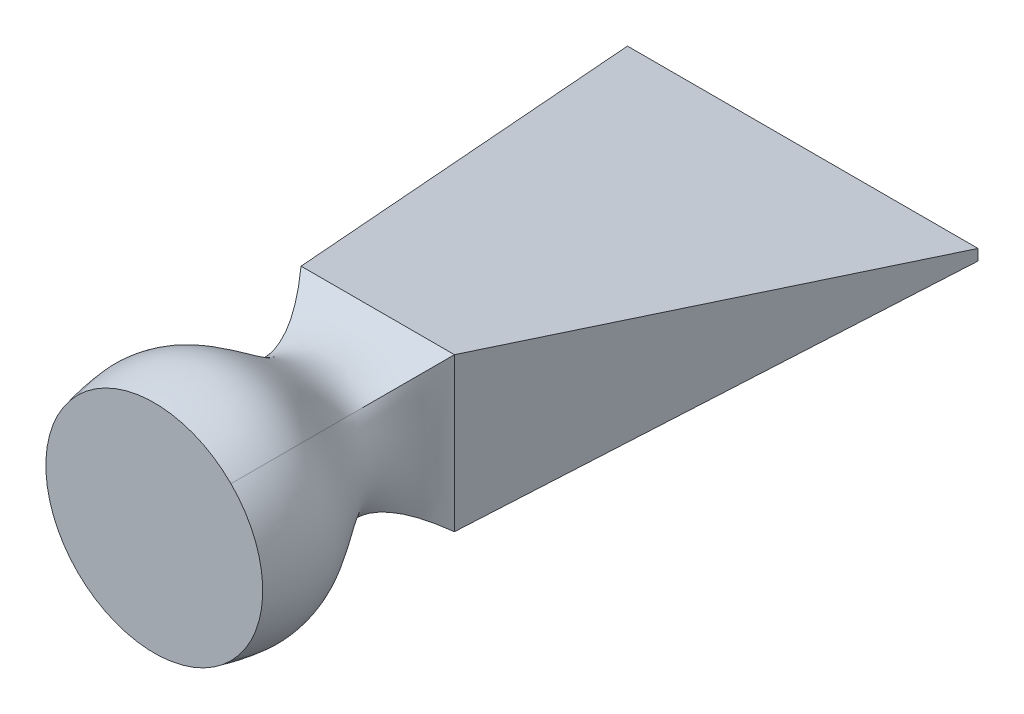
ISO-10303-21;
HEADER;
FILE_DESCRIPTION(('STEP AP214'),'2;1');
FILE_NAME('part.step','',(''),(''),'','','');
FILE_SCHEMA(('AUTOMOTIVE_DESIGN { 1 0 10303 214 1 1 1 1 }'));
ENDSEC;
DATA;
#1=APPLICATION_CONTEXT('core data for automotive mechanical design processes');
#2=APPLICATION_PROTOCOL_DEFINITION('international standard','automotive_design',2000,#1);
#3=PRODUCT_CONTEXT('',#1,'mechanical');
#4=PRODUCT('Part','Part','',(#3));
#5=PRODUCT_RELATED_PRODUCT_CATEGORY('part','',(#4));
#6=PRODUCT_DEFINITION_FORMATION('','',#4);
#7=PRODUCT_DEFINITION_CONTEXT('part definition',#1,'design');
#8=PRODUCT_DEFINITION('design','',#6,#7);
#9=PRODUCT_DEFINITION_SHAPE('','',#8);
#10=(LENGTH_UNIT() NAMED_UNIT(*) SI_UNIT(.MILLI.,.METRE.));
#11=(NAMED_UNIT(*) PLANE_ANGLE_UNIT() SI_UNIT($,.RADIAN.));
#12=(NAMED_UNIT(*) SI_UNIT($,.STERADIAN.) SOLID_ANGLE_UNIT());
#13=UNCERTAINTY_MEASURE_WITH_UNIT(LENGTH_MEASURE(1.E-05),#10,'distance_accuracy_value','');
#14=(GEOMETRIC_REPRESENTATION_CONTEXT(3) GLOBAL_UNCERTAINTY_ASSIGNED_CONTEXT((#13)) GLOBAL_UNIT_ASSIGNED_CONTEXT((#10,
#11,#12)) REPRESENTATION_CONTEXT('',''));
#15=CARTESIAN_POINT('',(0.,0.,0.));
#16=DIRECTION('',(0.,0.,1.));
#17=DIRECTION('',(1.,0.,0.));
#18=AXIS2_PLACEMENT_3D('',#15,#16,#17);
#19=CARTESIAN_POINT('',(0.,0.,102.));
#20=DIRECTION('',(0.,0.,1.));
#21=DIRECTION('',(1.,0.,0.));
#22=AXIS2_PLACEMENT_3D('',#19,#20,#21);
#23=PLANE('',#22);
#24=CARTESIAN_POINT('',(0.,0.,102.));
#25=DIRECTION('',(0.,0.,1.));
#26=DIRECTION('',(1.,0.,0.));
#27=AXIS2_PLACEMENT_3D('',#24,#25,#26);
#28=CIRCLE('',#27,49.4974746830583);
#29=CARTESIAN_POINT('',(-35.,35.,102.));
#30=VERTEX_POINT('',#29);
#31=CARTESIAN_POINT('',(-35.,-35.,102.));
#32=VERTEX_POINT('',#31);
#33=EDGE_CURVE('E12',#30,#32,#28,.T.);
#34=ORIENTED_EDGE('',*,*,#33,.T.);
#35=CARTESIAN_POINT('',(35.,-35.,102.));
#36=VERTEX_POINT('',#35);
#37=EDGE_CURVE('E82',#32,#36,#28,.T.);
#38=ORIENTED_EDGE('',*,*,#37,.T.);
#39=CARTESIAN_POINT('',(35.,35.,102.));
#40=VERTEX_POINT('',#39);
#41=EDGE_CURVE('E438',#36,#40,#28,.T.);
#42=ORIENTED_EDGE('',*,*,#41,.T.);
#43=EDGE_CURVE('E259',#40,#30,#28,.T.);
#44=ORIENTED_EDGE('',*,*,#43,.T.);
#45=EDGE_LOOP('',(#34,#38,#42,#44));
#46=FACE_BOUND('',#45,.T.);
#47=ADVANCED_FACE('F73',(#46),#23,.T.);
#48=CARTESIAN_POINT('',(-35.,-35.,0.));
#49=CARTESIAN_POINT('',(-25.8088022903976,-25.8088022903976,11.3333333333333));
#50=CARTESIAN_POINT('',(-13.9740324333379,-13.9740324333379,35.7263836367492));
#51=CARTESIAN_POINT('',(-39.2320888821546,-39.2320888821546,65.1603499334401));
#52=CARTESIAN_POINT('',(-37.1232419745733,-37.1232419745733,89.805704750183));
#53=CARTESIAN_POINT('',(-35.,-35.,102.));
#54=CARTESIAN_POINT('',(-11.6666666666667,-35.,0.));
#55=CARTESIAN_POINT('',(-8.60293409679921,-25.8088022903976,11.3333333333333));
#56=CARTESIAN_POINT('',(-7.70816347421794,-28.644191323389,35.7263836367492));
#57=CARTESIAN_POINT('',(-17.3372478460093,-59.7206332348576,65.1603499334401));
#58=CARTESIAN_POINT('',(-16.3907219775493,-56.4402673218818,89.805704750183));
#59=CARTESIAN_POINT('',(-15.6829746526915,-54.3170253473085,102.));
#60=CARTESIAN_POINT('',(11.6666666666667,-35.,0.));
#61=CARTESIAN_POINT('',(8.6029340967992,-25.8088022903976,11.3333333333333));
#62=CARTESIAN_POINT('',(7.70816347421792,-28.644191323389,35.7263836367492));
#63=CARTESIAN_POINT('',(17.3372478460093,-59.7206332348576,65.1603499334401));
#64=CARTESIAN_POINT('',(16.3907219775492,-56.4402673218818,89.805704750183));
#65=CARTESIAN_POINT('',(15.6829746526915,-54.3170253473085,102.));
#66=CARTESIAN_POINT('',(35.,-35.,0.));
#67=CARTESIAN_POINT('',(25.8088022903976,-25.8088022903976,11.3333333333333));
#68=CARTESIAN_POINT('',(13.9740324333379,-13.9740324333379,35.7263836367492));
#69=CARTESIAN_POINT('',(39.2320888821546,-39.2320888821546,65.1603499334401));
#70=CARTESIAN_POINT('',(37.1232419745732,-37.1232419745733,89.805704750183));
#71=CARTESIAN_POINT('',(35.,-35.,102.));
#72=B_SPLINE_SURFACE_WITH_KNOTS('',3,3,((#48,#49,#50,#51,#52,#53),(#54,#55,#56,#57,#58,#59),
(#60,#61,#62,#63,#64,#65),(#66,#67,#68,#69,#70,#71)),.UNSPECIFIED.,.F.,.F.,.F.,(4,4),(4,1,1,4),
(0.,1.),(0.,0.334441723312643,0.690834592156618,1.),.UNSPECIFIED.);
#73=DIRECTION('',(1.,0.,0.));
#74=VECTOR('',#73,1.);
#75=CARTESIAN_POINT('',(-35.,-35.,0.));
#76=LINE('',#75,#74);
#77=CARTESIAN_POINT('',(-35.,-35.,0.));
#78=VERTEX_POINT('',#77);
#79=CARTESIAN_POINT('',(35.,-35.,0.));
#80=VERTEX_POINT('',#79);
#81=EDGE_CURVE('E299',#78,#80,#76,.T.);
#82=CARTESIAN_POINT('',(35.,-35.,0.));
#83=CARTESIAN_POINT('',(25.8088022903976,-25.8088022903976,11.3333333333333));
#84=CARTESIAN_POINT('',(13.9740324333379,-13.9740324333379,35.7263836367492));
#85=CARTESIAN_POINT('',(39.2320888821546,-39.2320888821546,65.1603499334401));
#86=CARTESIAN_POINT('',(37.1232419745732,-37.1232419745733,89.805704750183));
#87=CARTESIAN_POINT('',(35.,-35.,102.));
#88=B_SPLINE_CURVE_WITH_KNOTS('',3,(#82,#83,#84,#85,#86,#87),.UNSPECIFIED.,.F.,.F.,(4,1,1,4),
(0.,0.334441723312643,0.690834592156618,1.),.UNSPECIFIED.);
#89=EDGE_CURVE('E279',#80,#36,#88,.T.);
#90=CARTESIAN_POINT('',(-35.,-35.,0.));
#91=CARTESIAN_POINT('',(-25.8088022903976,-25.8088022903976,11.3333333333333));
#92=CARTESIAN_POINT('',(-13.9740324333379,-13.9740324333379,35.7263836367492));
#93=CARTESIAN_POINT('',(-39.2320888821546,-39.2320888821546,65.1603499334401));
#94=CARTESIAN_POINT('',(-37.1232419745733,-37.1232419745733,89.805704750183));
#95=CARTESIAN_POINT('',(-35.,-35.,102.));
#96=B_SPLINE_CURVE_WITH_KNOTS('',3,(#90,#91,#92,#93,#94,#95),.UNSPECIFIED.,.F.,.F.,(4,1,1,4),
(0.,0.334441723312643,0.690834592156618,1.),.UNSPECIFIED.);
#97=EDGE_CURVE('E289',#32,#78,#96,.F.);
#98=ORIENTED_EDGE('',*,*,#81,.T.);
#99=ORIENTED_EDGE('',*,*,#89,.T.);
#100=ORIENTED_EDGE('',*,*,#37,.F.);
#101=ORIENTED_EDGE('',*,*,#97,.T.);
#102=EDGE_LOOP('',(#98,#99,#100,#101));
#103=FACE_BOUND('',#102,.T.);
#104=ADVANCED_FACE('F186',(#103),#72,.T.);
#105=CARTESIAN_POINT('',(35.,-35.,0.));
#106=CARTESIAN_POINT('',(25.8088022903976,-25.8088022903976,11.3333333333333));
#107=CARTESIAN_POINT('',(13.9740324333379,-13.9740324333379,35.7263836367492));
#108=CARTESIAN_POINT('',(39.2320888821546,-39.2320888821546,65.1603499334401));
#109=CARTESIAN_POINT('',(37.1232419745732,-37.1232419745733,89.805704750183));
#110=CARTESIAN_POINT('',(35.,-35.,102.));
#111=CARTESIAN_POINT('',(35.,-11.6666666666667,0.));
#112=CARTESIAN_POINT('',(25.8088022903976,-8.60293409679921,11.3333333333333));
#113=CARTESIAN_POINT('',(28.644191323389,-7.70816347421794,35.7263836367492));
#114=CARTESIAN_POINT('',(59.7206332348576,-17.3372478460093,65.1603499334401));
#115=CARTESIAN_POINT('',(56.4402673218818,-16.3907219775493,89.805704750183));
#116=CARTESIAN_POINT('',(54.3170253473085,-15.6829746526915,102.));
#117=CARTESIAN_POINT('',(35.,11.6666666666667,0.));
#118=CARTESIAN_POINT('',(25.8088022903976,8.6029340967992,11.3333333333333));
#119=CARTESIAN_POINT('',(28.644191323389,7.70816347421792,35.7263836367492));
#120=CARTESIAN_POINT('',(59.7206332348576,17.3372478460093,65.1603499334401));
#121=CARTESIAN_POINT('',(56.4402673218818,16.3907219775492,89.805704750183));
#122=CARTESIAN_POINT('',(54.3170253473085,15.6829746526915,102.));
#123=CARTESIAN_POINT('',(35.,35.,0.));
#124=CARTESIAN_POINT('',(25.8088022903976,25.8088022903976,11.3333333333333));
#125=CARTESIAN_POINT('',(13.9740324333379,13.9740324333379,35.7263836367492));
#126=CARTESIAN_POINT('',(39.2320888821546,39.2320888821546,65.1603499334401));
#127=CARTESIAN_POINT('',(37.1232419745733,37.1232419745732,89.805704750183));
#128=CARTESIAN_POINT('',(35.,35.,102.));
#129=B_SPLINE_SURFACE_WITH_KNOTS('',3,3,((#105,#106,#107,#108,#109,#110),(#111,#112,#113,#114,
#115,#116),(#117,#118,#119,#120,#121,#122),(#123,#124,#125,#126,#127,#128)),.UNSPECIFIED.,.F.,
.F.,.F.,(4,4),(4,1,1,4),(0.,1.),(0.,0.334441723312643,0.690834592156618,1.),.UNSPECIFIED.);
#130=DIRECTION('',(0.,1.,0.));
#131=VECTOR('',#130,1.);
#132=CARTESIAN_POINT('',(35.,-35.,0.));
#133=LINE('',#132,#131);
#134=CARTESIAN_POINT('',(35.,35.,0.));
#135=VERTEX_POINT('',#134);
#136=EDGE_CURVE('E158',#80,#135,#133,.T.);
#137=CARTESIAN_POINT('',(35.,35.,0.));
#138=CARTESIAN_POINT('',(25.8088022903976,25.8088022903976,11.3333333333333));
#139=CARTESIAN_POINT('',(13.9740324333379,13.9740324333379,35.7263836367492));
#140=CARTESIAN_POINT('',(39.2320888821546,39.2320888821546,65.1603499334401));
#141=CARTESIAN_POINT('',(37.1232419745733,37.1232419745732,89.805704750183));
#142=CARTESIAN_POINT('',(35.,35.,102.));
#143=B_SPLINE_CURVE_WITH_KNOTS('',3,(#137,#138,#139,#140,#141,#142),.UNSPECIFIED.,.F.,.F.,(4,1,
1,4),(0.,0.334441723312643,0.690834592156618,1.),.UNSPECIFIED.);
#144=EDGE_CURVE('E270',#135,#40,#143,.T.);
#145=ORIENTED_EDGE('',*,*,#136,.T.);
#146=ORIENTED_EDGE('',*,*,#144,.T.);
#147=ORIENTED_EDGE('',*,*,#41,.F.);
#148=ORIENTED_EDGE('',*,*,#89,.F.);
#149=EDGE_LOOP('',(#145,#146,#147,#148));
#150=FACE_BOUND('',#149,.T.);
#151=ADVANCED_FACE('F192',(#150),#129,.T.);
#152=CARTESIAN_POINT('',(-35.,35.,0.));
#153=CARTESIAN_POINT('',(-25.8088022903976,25.8088022903976,11.3333333333333));
#154=CARTESIAN_POINT('',(-13.9740324333379,13.9740324333379,35.7263836367492));
#155=CARTESIAN_POINT('',(-39.2320888821546,39.2320888821546,65.1603499334401));
#156=CARTESIAN_POINT('',(-37.1232419745733,37.1232419745733,89.805704750183));
#157=CARTESIAN_POINT('',(-35.,35.,102.));
#158=CARTESIAN_POINT('',(-35.,11.6666666666667,0.));
#159=CARTESIAN_POINT('',(-25.8088022903976,8.6029340967992,11.3333333333333));
#160=CARTESIAN_POINT('',(-28.644191323389,7.70816347421793,35.7263836367492));
#161=CARTESIAN_POINT('',(-59.7206332348576,17.3372478460093,65.1603499334401));
#162=CARTESIAN_POINT('',(-56.4402673218818,16.3907219775492,89.805704750183));
#163=CARTESIAN_POINT('',(-54.3170253473085,15.6829746526915,102.));
#164=CARTESIAN_POINT('',(-35.,-11.6666666666667,0.));
#165=CARTESIAN_POINT('',(-25.8088022903976,-8.60293409679921,11.3333333333333));
#166=CARTESIAN_POINT('',(-28.644191323389,-7.70816347421792,35.7263836367492));
#167=CARTESIAN_POINT('',(-59.7206332348576,-17.3372478460093,65.1603499334401));
#168=CARTESIAN_POINT('',(-56.4402673218818,-16.3907219775492,89.805704750183));
#169=CARTESIAN_POINT('',(-54.3170253473085,-15.6829746526915,102.));
#170=CARTESIAN_POINT('',(-35.,-35.,0.));
#171=CARTESIAN_POINT('',(-25.8088022903976,-25.8088022903976,11.3333333333333));
#172=CARTESIAN_POINT('',(-13.9740324333379,-13.9740324333379,35.7263836367492));
#173=CARTESIAN_POINT('',(-39.2320888821546,-39.2320888821546,65.1603499334401));
#174=CARTESIAN_POINT('',(-37.1232419745733,-37.1232419745733,89.805704750183));
#175=CARTESIAN_POINT('',(-35.,-35.,102.));
#176=B_SPLINE_SURFACE_WITH_KNOTS('',3,3,((#152,#153,#154,#155,#156,#157),(#158,#159,#160,#161,
#162,#163),(#164,#165,#166,#167,#168,#169),(#170,#171,#172,#173,#174,#175)),.UNSPECIFIED.,.F.,
.F.,.F.,(4,4),(4,1,1,4),(0.,1.),(0.,0.334441723312643,0.690834592156618,1.),.UNSPECIFIED.);
#177=DIRECTION('',(0.,-1.,0.));
#178=VECTOR('',#177,1.);
#179=CARTESIAN_POINT('',(-35.,-35.,0.));
#180=LINE('',#179,#178);
#181=CARTESIAN_POINT('',(-35.,35.,0.));
#182=VERTEX_POINT('',#181);
#183=EDGE_CURVE('E435',#182,#78,#180,.T.);
#184=CARTESIAN_POINT('',(-35.,35.,0.));
#185=CARTESIAN_POINT('',(-25.8088022903976,25.8088022903976,11.3333333333333));
#186=CARTESIAN_POINT('',(-13.9740324333379,13.9740324333379,35.7263836367492));
#187=CARTESIAN_POINT('',(-39.2320888821546,39.2320888821546,65.1603499334401));
#188=CARTESIAN_POINT('',(-37.1232419745733,37.1232419745733,89.805704750183));
#189=CARTESIAN_POINT('',(-35.,35.,102.));
#190=B_SPLINE_CURVE_WITH_KNOTS('',3,(#184,#185,#186,#187,#188,#189),.UNSPECIFIED.,.F.,.F.,(4,1,
1,4),(0.,0.334441723312643,0.690834592156618,1.),.UNSPECIFIED.);
#191=EDGE_CURVE('E265',#182,#30,#190,.T.);
#192=ORIENTED_EDGE('',*,*,#183,.T.);
#193=ORIENTED_EDGE('',*,*,#97,.F.);
#194=ORIENTED_EDGE('',*,*,#33,.F.);
#195=ORIENTED_EDGE('',*,*,#191,.F.);
#196=EDGE_LOOP('',(#192,#193,#194,#195));
#197=FACE_BOUND('',#196,.T.);
#198=ADVANCED_FACE('F222',(#197),#176,.T.);
#199=CARTESIAN_POINT('',(35.,35.,0.));
#200=CARTESIAN_POINT('',(25.8088022903976,25.8088022903976,11.3333333333333));
#201=CARTESIAN_POINT('',(13.9740324333379,13.9740324333379,35.7263836367492));
#202=CARTESIAN_POINT('',(39.2320888821546,39.2320888821546,65.1603499334401));
#203=CARTESIAN_POINT('',(37.1232419745732,37.1232419745733,89.805704750183));
#204=CARTESIAN_POINT('',(35.,35.,102.));
#205=CARTESIAN_POINT('',(11.6666666666667,35.,0.));
#206=CARTESIAN_POINT('',(8.6029340967992,25.8088022903976,11.3333333333333));
#207=CARTESIAN_POINT('',(7.70816347421793,28.644191323389,35.7263836367492));
#208=CARTESIAN_POINT('',(17.3372478460093,59.7206332348576,65.1603499334401));
#209=CARTESIAN_POINT('',(16.3907219775492,56.4402673218818,89.805704750183));
#210=CARTESIAN_POINT('',(15.6829746526915,54.3170253473085,102.));
#211=CARTESIAN_POINT('',(-11.6666666666667,35.,0.));
#212=CARTESIAN_POINT('',(-8.60293409679921,25.8088022903976,11.3333333333333));
#213=CARTESIAN_POINT('',(-7.70816347421792,28.644191323389,35.7263836367492));
#214=CARTESIAN_POINT('',(-17.3372478460093,59.7206332348576,65.1603499334401));
#215=CARTESIAN_POINT('',(-16.3907219775493,56.4402673218818,89.805704750183));
#216=CARTESIAN_POINT('',(-15.6829746526915,54.3170253473085,102.));
#217=CARTESIAN_POINT('',(-35.,35.,0.));
#218=CARTESIAN_POINT('',(-25.8088022903976,25.8088022903976,11.3333333333333));
#219=CARTESIAN_POINT('',(-13.9740324333379,13.9740324333379,35.7263836367492));
#220=CARTESIAN_POINT('',(-39.2320888821546,39.2320888821546,65.1603499334401));
#221=CARTESIAN_POINT('',(-37.1232419745733,37.1232419745733,89.805704750183));
#222=CARTESIAN_POINT('',(-35.,35.,102.));
#223=B_SPLINE_SURFACE_WITH_KNOTS('',3,3,((#199,#200,#201,#202,#203,#204),(#205,#206,#207,#208,
#209,#210),(#211,#212,#213,#214,#215,#216),(#217,#218,#219,#220,#221,#222)),.UNSPECIFIED.,.F.,
.F.,.F.,(4,4),(4,1,1,4),(0.,1.),(0.,0.334441723312643,0.690834592156618,1.),.UNSPECIFIED.);
#224=DIRECTION('',(-1.,0.,0.));
#225=VECTOR('',#224,1.);
#226=CARTESIAN_POINT('',(-35.,35.,0.));
#227=LINE('',#226,#225);
#228=EDGE_CURVE('E431',#135,#182,#227,.T.);
#229=ORIENTED_EDGE('',*,*,#228,.T.);
#230=ORIENTED_EDGE('',*,*,#191,.T.);
#231=ORIENTED_EDGE('',*,*,#43,.F.);
#232=ORIENTED_EDGE('',*,*,#144,.F.);
#233=EDGE_LOOP('',(#229,#230,#231,#232));
#234=FACE_BOUND('',#233,.T.);
#235=ADVANCED_FACE('F232',(#234),#223,.T.);
#236=CARTESIAN_POINT('',(0.,0.,-194.));
#237=DIRECTION('',(0.,0.,-1.));
#238=DIRECTION('',(-1.,0.,0.));
#239=AXIS2_PLACEMENT_3D('',#236,#237,#238);
#240=PLANE('',#239);
#241=DIRECTION('',(0.,-1.,0.));
#242=VECTOR('',#241,1.);
#243=CARTESIAN_POINT('',(-80.,2.49999999999998,-194.));
#244=LINE('',#243,#242);
#245=CARTESIAN_POINT('',(-80.,2.49999999999998,-194.));
#246=VERTEX_POINT('',#245);
#247=CARTESIAN_POINT('',(-80.,-2.50000000000002,-194.));
#248=VERTEX_POINT('',#247);
#249=EDGE_CURVE('E152',#246,#248,#244,.T.);
#250=ORIENTED_EDGE('',*,*,#249,.F.);
#251=DIRECTION('',(-1.,0.,0.));
#252=VECTOR('',#251,1.);
#253=CARTESIAN_POINT('',(80.,2.50000000000001,-194.));
#254=LINE('',#253,#252);
#255=CARTESIAN_POINT('',(80.,2.50000000000001,-194.));
#256=VERTEX_POINT('',#255);
#257=EDGE_CURVE('E134',#256,#246,#254,.T.);
#258=ORIENTED_EDGE('',*,*,#257,.F.);
#259=DIRECTION('',(0.,1.,0.));
#260=VECTOR('',#259,1.);
#261=CARTESIAN_POINT('',(80.,2.50000000000001,-194.));
#262=LINE('',#261,#260);
#263=CARTESIAN_POINT('',(80.,-2.49999999999999,-194.));
#264=VERTEX_POINT('',#263);
#265=EDGE_CURVE('E125',#264,#256,#262,.T.);
#266=ORIENTED_EDGE('',*,*,#265,.F.);
#267=DIRECTION('',(1.,0.,0.));
#268=VECTOR('',#267,1.);
#269=CARTESIAN_POINT('',(80.,-2.49999999999999,-194.));
#270=LINE('',#269,#268);
#271=EDGE_CURVE('E130',#248,#264,#270,.T.);
#272=ORIENTED_EDGE('',*,*,#271,.F.);
#273=EDGE_LOOP('',(#250,#258,#266,#272));
#274=FACE_BOUND('',#273,.T.);
#275=ADVANCED_FACE('F129',(#274),#240,.T.);
#276=CARTESIAN_POINT('',(-33.212980005547,0.,7.704041753864));
#277=DIRECTION('',(0.974136687468844,0.,-0.225959540907722));
#278=DIRECTION('',(-0.225959540907722,0.,-0.974136687468844));
#279=AXIS2_PLACEMENT_3D('',#276,#277,#278);
#280=PLANE('',#279);
#281=DIRECTION('',(0.22300946432328,-0.161062390900147,0.96141857952703));
#282=VECTOR('',#281,1.);
#283=CARTESIAN_POINT('',(-80.,-2.50000000000002,-194.));
#284=LINE('',#283,#282);
#285=EDGE_CURVE('E151',#248,#78,#284,.T.);
#286=ORIENTED_EDGE('',*,*,#285,.T.);
#287=ORIENTED_EDGE('',*,*,#183,.F.);
#288=DIRECTION('',(0.22300946432328,0.161062390900147,0.96141857952703));
#289=VECTOR('',#288,1.);
#290=CARTESIAN_POINT('',(-80.,2.49999999999998,-194.));
#291=LINE('',#290,#289);
#292=EDGE_CURVE('E160',#246,#182,#291,.T.);
#293=ORIENTED_EDGE('',*,*,#292,.F.);
#294=ORIENTED_EDGE('',*,*,#249,.T.);
#295=EDGE_LOOP('',(#286,#287,#293,#294));
#296=FACE_BOUND('',#295,.T.);
#297=ADVANCED_FACE('F312',(#296),#280,.F.);
#298=CARTESIAN_POINT('',(0.,34.0445438039918,-5.7033385238646));
#299=DIRECTION('',(0.,-0.986256179469929,0.165223329034911));
#300=DIRECTION('',(0.,-0.165223329034911,-0.986256179469929));
#301=AXIS2_PLACEMENT_3D('',#298,#299,#300);
#302=PLANE('',#301);
#303=ORIENTED_EDGE('',*,*,#292,.T.);
#304=ORIENTED_EDGE('',*,*,#228,.F.);
#305=DIRECTION('',(-0.22300946432328,0.161062390900147,0.96141857952703));
#306=VECTOR('',#305,1.);
#307=CARTESIAN_POINT('',(80.,2.50000000000001,-194.));
#308=LINE('',#307,#306);
#309=EDGE_CURVE('E159',#256,#135,#308,.T.);
#310=ORIENTED_EDGE('',*,*,#309,.F.);
#311=ORIENTED_EDGE('',*,*,#257,.T.);
#312=EDGE_LOOP('',(#303,#304,#310,#311));
#313=FACE_BOUND('',#312,.T.);
#314=ADVANCED_FACE('F357',(#313),#302,.F.);
#315=CARTESIAN_POINT('',(0.,-34.0445438039918,-5.7033385238646));
#316=DIRECTION('',(0.,0.986256179469929,0.165223329034911));
#317=DIRECTION('',(0.,-0.165223329034911,0.986256179469929));
#318=AXIS2_PLACEMENT_3D('',#315,#316,#317);
#319=PLANE('',#318);
#320=DIRECTION('',(-0.22300946432328,-0.161062390900147,0.96141857952703));
#321=VECTOR('',#320,1.);
#322=CARTESIAN_POINT('',(80.,-2.49999999999999,-194.));
#323=LINE('',#322,#321);
#324=EDGE_CURVE('E148',#264,#80,#323,.T.);
#325=ORIENTED_EDGE('',*,*,#324,.T.);
#326=ORIENTED_EDGE('',*,*,#81,.F.);
#327=ORIENTED_EDGE('',*,*,#285,.F.);
#328=ORIENTED_EDGE('',*,*,#271,.T.);
#329=EDGE_LOOP('',(#325,#326,#327,#328));
#330=FACE_BOUND('',#329,.T.);
#331=ADVANCED_FACE('F147',(#330),#319,.F.);
#332=CARTESIAN_POINT('',(33.212980005547,0.,7.70404175386399));
#333=DIRECTION('',(-0.974136687468844,0.,-0.225959540907721));
#334=DIRECTION('',(-0.225959540907721,0.,0.974136687468844));
#335=AXIS2_PLACEMENT_3D('',#332,#333,#334);
#336=PLANE('',#335);
#337=ORIENTED_EDGE('',*,*,#309,.T.);
#338=ORIENTED_EDGE('',*,*,#136,.F.);
#339=ORIENTED_EDGE('',*,*,#324,.F.);
#340=ORIENTED_EDGE('',*,*,#265,.T.);
#341=EDGE_LOOP('',(#337,#338,#339,#340));
#342=FACE_BOUND('',#341,.T.);
#343=ADVANCED_FACE('F156',(#342),#336,.F.);
#344=CLOSED_SHELL('',(#47,#104,#151,#198,#235,#275,#297,#314,#331,#343));
#345=MANIFOLD_SOLID_BREP('B2',#344);
#346=ADVANCED_BREP_SHAPE_REPRESENTATION('',(#18,#345),#14);
#347=SHAPE_DEFINITION_REPRESENTATION(#9,#346);
ENDSEC;
END-ISO-10303-21;
